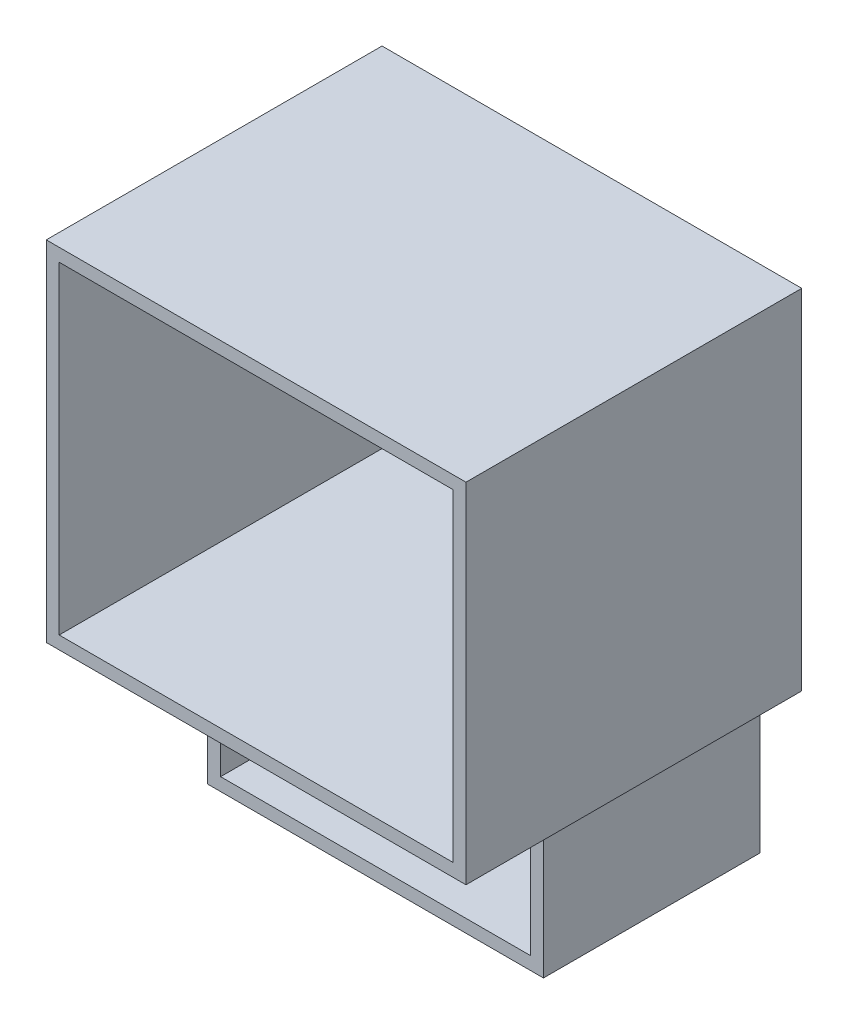
ISO-10303-21;
HEADER;
FILE_DESCRIPTION(('STEP AP214'),'2;1');
FILE_NAME('part.step','',(''),(''),'','','');
FILE_SCHEMA(('AUTOMOTIVE_DESIGN { 1 0 10303 214 1 1 1 1 }'));
ENDSEC;
DATA;
#1=APPLICATION_CONTEXT('core data for automotive mechanical design processes');
#2=APPLICATION_PROTOCOL_DEFINITION('international standard','automotive_design',2000,#1);
#3=PRODUCT_CONTEXT('',#1,'mechanical');
#4=PRODUCT('Part','Part','',(#3));
#5=PRODUCT_RELATED_PRODUCT_CATEGORY('part','',(#4));
#6=PRODUCT_DEFINITION_FORMATION('','',#4);
#7=PRODUCT_DEFINITION_CONTEXT('part definition',#1,'design');
#8=PRODUCT_DEFINITION('design','',#6,#7);
#9=PRODUCT_DEFINITION_SHAPE('','',#8);
#10=(LENGTH_UNIT() NAMED_UNIT(*) SI_UNIT(.MILLI.,.METRE.));
#11=(NAMED_UNIT(*) PLANE_ANGLE_UNIT() SI_UNIT($,.RADIAN.));
#12=(NAMED_UNIT(*) SI_UNIT($,.STERADIAN.) SOLID_ANGLE_UNIT());
#13=UNCERTAINTY_MEASURE_WITH_UNIT(LENGTH_MEASURE(1.E-05),#10,'distance_accuracy_value','');
#14=(GEOMETRIC_REPRESENTATION_CONTEXT(3) GLOBAL_UNCERTAINTY_ASSIGNED_CONTEXT((#13)) GLOBAL_UNIT_ASSIGNED_CONTEXT((#10,
#11,#12)) REPRESENTATION_CONTEXT('',''));
#15=CARTESIAN_POINT('',(0.,0.,0.));
#16=DIRECTION('',(0.,0.,1.));
#17=DIRECTION('',(1.,0.,0.));
#18=AXIS2_PLACEMENT_3D('',#15,#16,#17);
#19=CARTESIAN_POINT('',(-18.8,-30.,3.5));
#20=DIRECTION('',(0.,0.,-1.));
#21=DIRECTION('',(-1.,0.,0.));
#22=AXIS2_PLACEMENT_3D('',#19,#20,#21);
#23=CYLINDRICAL_SURFACE('',#22,1.8);
#24=CARTESIAN_POINT('',(-18.8,-30.,3.5));
#25=DIRECTION('',(0.,0.,1.));
#26=DIRECTION('',(1.,0.,0.));
#27=AXIS2_PLACEMENT_3D('',#24,#25,#26);
#28=CIRCLE('',#27,1.8);
#29=CARTESIAN_POINT('',(-17.,-30.,3.5));
#30=VERTEX_POINT('',#29);
#31=EDGE_CURVE('E232',#30,#30,#28,.T.);
#32=ORIENTED_EDGE('',*,*,#31,.T.);
#33=EDGE_LOOP('',(#32));
#34=FACE_BOUND('',#33,.T.);
#35=CARTESIAN_POINT('',(-18.8,-30.,2.5));
#36=DIRECTION('',(0.,0.,-1.));
#37=DIRECTION('',(-1.,0.,0.));
#38=AXIS2_PLACEMENT_3D('',#35,#36,#37);
#39=CIRCLE('',#38,1.8);
#40=CARTESIAN_POINT('',(-20.6,-30.,2.5));
#41=VERTEX_POINT('',#40);
#42=EDGE_CURVE('E67',#41,#41,#39,.T.);
#43=ORIENTED_EDGE('',*,*,#42,.T.);
#44=EDGE_LOOP('',(#43));
#45=FACE_BOUND('',#44,.T.);
#46=ADVANCED_FACE('F63',(#34,#45),#23,.F.);
#47=CARTESIAN_POINT('',(18.8,-30.,3.5));
#48=DIRECTION('',(0.,0.,-1.));
#49=DIRECTION('',(-1.,0.,0.));
#50=AXIS2_PLACEMENT_3D('',#47,#48,#49);
#51=CYLINDRICAL_SURFACE('',#50,1.8);
#52=CARTESIAN_POINT('',(18.8,-30.,3.5));
#53=DIRECTION('',(0.,0.,1.));
#54=DIRECTION('',(-1.,0.,0.));
#55=AXIS2_PLACEMENT_3D('',#52,#53,#54);
#56=CIRCLE('',#55,1.8);
#57=CARTESIAN_POINT('',(17.,-30.,3.5));
#58=VERTEX_POINT('',#57);
#59=EDGE_CURVE('E210',#58,#58,#56,.T.);
#60=ORIENTED_EDGE('',*,*,#59,.T.);
#61=EDGE_LOOP('',(#60));
#62=FACE_BOUND('',#61,.T.);
#63=CARTESIAN_POINT('',(18.8,-30.,2.5));
#64=DIRECTION('',(0.,0.,-1.));
#65=DIRECTION('',(-1.,0.,0.));
#66=AXIS2_PLACEMENT_3D('',#63,#64,#65);
#67=CIRCLE('',#66,1.8);
#68=CARTESIAN_POINT('',(17.,-30.,2.5));
#69=VERTEX_POINT('',#68);
#70=EDGE_CURVE('E331',#69,#69,#67,.T.);
#71=ORIENTED_EDGE('',*,*,#70,.T.);
#72=EDGE_LOOP('',(#71));
#73=FACE_BOUND('',#72,.T.);
#74=ADVANCED_FACE('F378',(#62,#73),#51,.F.);
#75=CARTESIAN_POINT('',(-32.5,-27.,2.));
#76=DIRECTION('',(0.,1.,0.));
#77=DIRECTION('',(0.,0.,1.));
#78=AXIS2_PLACEMENT_3D('',#75,#76,#77);
#79=PLANE('',#78);
#80=DIRECTION('',(0.,0.,-1.));
#81=VECTOR('',#80,1.);
#82=CARTESIAN_POINT('',(-26.,-27.,3.5));
#83=LINE('',#82,#81);
#84=CARTESIAN_POINT('',(-26.,-27.,33.5));
#85=VERTEX_POINT('',#84);
#86=CARTESIAN_POINT('',(-26.,-27.,0.));
#87=VERTEX_POINT('',#86);
#88=EDGE_CURVE('E80',#85,#87,#83,.T.);
#89=ORIENTED_EDGE('',*,*,#88,.F.);
#90=DIRECTION('',(1.,0.,0.));
#91=VECTOR('',#90,1.);
#92=CARTESIAN_POINT('',(-26.,-27.,33.5));
#93=LINE('',#92,#91);
#94=CARTESIAN_POINT('',(-24.,-27.,33.5));
#95=VERTEX_POINT('',#94);
#96=EDGE_CURVE('E85',#85,#95,#93,.T.);
#97=ORIENTED_EDGE('',*,*,#96,.T.);
#98=DIRECTION('',(0.,0.,-1.));
#99=VECTOR('',#98,1.);
#100=CARTESIAN_POINT('',(-24.,-27.,33.5));
#101=LINE('',#100,#99);
#102=CARTESIAN_POINT('',(-24.,-27.,3.5));
#103=VERTEX_POINT('',#102);
#104=EDGE_CURVE('E212',#95,#103,#101,.T.);
#105=ORIENTED_EDGE('',*,*,#104,.T.);
#106=DIRECTION('',(-1.,0.,0.));
#107=VECTOR('',#106,1.);
#108=CARTESIAN_POINT('',(-26.,-27.,3.5));
#109=LINE('',#108,#107);
#110=CARTESIAN_POINT('',(24.,-27.,3.5));
#111=VERTEX_POINT('',#110);
#112=EDGE_CURVE('E236',#111,#103,#109,.T.);
#113=ORIENTED_EDGE('',*,*,#112,.F.);
#114=DIRECTION('',(0.,0.,-1.));
#115=VECTOR('',#114,1.);
#116=CARTESIAN_POINT('',(24.,-27.,33.5));
#117=LINE('',#116,#115);
#118=CARTESIAN_POINT('',(24.,-27.,33.5));
#119=VERTEX_POINT('',#118);
#120=EDGE_CURVE('E207',#119,#111,#117,.T.);
#121=ORIENTED_EDGE('',*,*,#120,.F.);
#122=CARTESIAN_POINT('',(26.,-27.,33.5));
#123=VERTEX_POINT('',#122);
#124=EDGE_CURVE('E229',#119,#123,#93,.T.);
#125=ORIENTED_EDGE('',*,*,#124,.T.);
#126=DIRECTION('',(0.,0.,-1.));
#127=VECTOR('',#126,1.);
#128=CARTESIAN_POINT('',(26.,-27.,3.5));
#129=LINE('',#128,#127);
#130=CARTESIAN_POINT('',(26.,-27.,0.));
#131=VERTEX_POINT('',#130);
#132=EDGE_CURVE('E245',#123,#131,#129,.T.);
#133=ORIENTED_EDGE('',*,*,#132,.T.);
#134=DIRECTION('',(1.,0.,0.));
#135=VECTOR('',#134,1.);
#136=CARTESIAN_POINT('',(-32.5,-27.,0.));
#137=LINE('',#136,#135);
#138=CARTESIAN_POINT('',(32.5,-27.,0.));
#139=VERTEX_POINT('',#138);
#140=EDGE_CURVE('E321',#131,#139,#137,.T.);
#141=ORIENTED_EDGE('',*,*,#140,.T.);
#142=DIRECTION('',(0.,0.,-1.));
#143=VECTOR('',#142,1.);
#144=CARTESIAN_POINT('',(32.5,-27.,2.));
#145=LINE('',#144,#143);
#146=CARTESIAN_POINT('',(32.5,-27.,52.));
#147=VERTEX_POINT('',#146);
#148=EDGE_CURVE('E324',#147,#139,#145,.T.);
#149=ORIENTED_EDGE('',*,*,#148,.F.);
#150=DIRECTION('',(1.,0.,0.));
#151=VECTOR('',#150,1.);
#152=CARTESIAN_POINT('',(-32.5,-27.,52.));
#153=LINE('',#152,#151);
#154=CARTESIAN_POINT('',(-32.5,-27.,52.));
#155=VERTEX_POINT('',#154);
#156=EDGE_CURVE('E287',#155,#147,#153,.T.);
#157=ORIENTED_EDGE('',*,*,#156,.F.);
#158=DIRECTION('',(0.,0.,-1.));
#159=VECTOR('',#158,1.);
#160=CARTESIAN_POINT('',(-32.5,-27.,2.));
#161=LINE('',#160,#159);
#162=CARTESIAN_POINT('',(-32.5,-27.,0.));
#163=VERTEX_POINT('',#162);
#164=EDGE_CURVE('E327',#155,#163,#161,.T.);
#165=ORIENTED_EDGE('',*,*,#164,.T.);
#166=EDGE_CURVE('E322',#163,#87,#137,.T.);
#167=ORIENTED_EDGE('',*,*,#166,.T.);
#168=EDGE_LOOP('',(#89,#97,#105,#113,#121,#125,#133,#141,#149,#157,#165,#167));
#169=FACE_BOUND('',#168,.T.);
#170=ADVANCED_FACE('F367',(#169),#79,.F.);
#171=CARTESIAN_POINT('',(0.,0.,2.));
#172=DIRECTION('',(0.,0.,-1.));
#173=DIRECTION('',(-1.,0.,0.));
#174=AXIS2_PLACEMENT_3D('',#171,#172,#173);
#175=PLANE('',#174);
#176=DIRECTION('',(1.,0.,0.));
#177=VECTOR('',#176,1.);
#178=CARTESIAN_POINT('',(-30.5,-25.,2.));
#179=LINE('',#178,#177);
#180=CARTESIAN_POINT('',(-30.5,-25.,2.));
#181=VERTEX_POINT('',#180);
#182=CARTESIAN_POINT('',(30.5,-25.,2.));
#183=VERTEX_POINT('',#182);
#184=EDGE_CURVE('E252',#181,#183,#179,.T.);
#185=ORIENTED_EDGE('',*,*,#184,.T.);
#186=DIRECTION('',(0.,1.,0.));
#187=VECTOR('',#186,1.);
#188=CARTESIAN_POINT('',(30.5,-25.,2.));
#189=LINE('',#188,#187);
#190=CARTESIAN_POINT('',(30.5,25.,2.));
#191=VERTEX_POINT('',#190);
#192=EDGE_CURVE('E248',#183,#191,#189,.T.);
#193=ORIENTED_EDGE('',*,*,#192,.T.);
#194=DIRECTION('',(-1.,0.,0.));
#195=VECTOR('',#194,1.);
#196=CARTESIAN_POINT('',(-30.5,25.,2.));
#197=LINE('',#196,#195);
#198=CARTESIAN_POINT('',(-30.5,25.,2.));
#199=VERTEX_POINT('',#198);
#200=EDGE_CURVE('E262',#191,#199,#197,.T.);
#201=ORIENTED_EDGE('',*,*,#200,.T.);
#202=DIRECTION('',(0.,-1.,0.));
#203=VECTOR('',#202,1.);
#204=CARTESIAN_POINT('',(-30.5,-25.,2.));
#205=LINE('',#204,#203);
#206=EDGE_CURVE('E265',#199,#181,#205,.T.);
#207=ORIENTED_EDGE('',*,*,#206,.T.);
#208=EDGE_LOOP('',(#185,#193,#201,#207));
#209=FACE_BOUND('',#208,.T.);
#210=CARTESIAN_POINT('',(-26.,18.5,2.));
#211=DIRECTION('',(0.,0.,1.));
#212=DIRECTION('',(1.,0.,0.));
#213=AXIS2_PLACEMENT_3D('',#210,#211,#212);
#214=CIRCLE('',#213,1.5);
#215=CARTESIAN_POINT('',(-24.5,18.5,2.));
#216=VERTEX_POINT('',#215);
#217=EDGE_CURVE('E309',#216,#216,#214,.T.);
#218=ORIENTED_EDGE('',*,*,#217,.F.);
#219=EDGE_LOOP('',(#218));
#220=FACE_BOUND('',#219,.T.);
#221=CARTESIAN_POINT('',(26.,18.5,2.));
#222=DIRECTION('',(0.,0.,1.));
#223=DIRECTION('',(-1.,0.,0.));
#224=AXIS2_PLACEMENT_3D('',#221,#222,#223);
#225=CIRCLE('',#224,1.5);
#226=CARTESIAN_POINT('',(24.5,18.5,2.));
#227=VERTEX_POINT('',#226);
#228=EDGE_CURVE('E303',#227,#227,#225,.T.);
#229=ORIENTED_EDGE('',*,*,#228,.F.);
#230=EDGE_LOOP('',(#229));
#231=FACE_BOUND('',#230,.T.);
#232=CARTESIAN_POINT('',(-26.,-18.5,2.));
#233=DIRECTION('',(0.,0.,1.));
#234=DIRECTION('',(-1.,0.,0.));
#235=AXIS2_PLACEMENT_3D('',#232,#233,#234);
#236=CIRCLE('',#235,1.5);
#237=CARTESIAN_POINT('',(-27.5,-18.5,2.));
#238=VERTEX_POINT('',#237);
#239=EDGE_CURVE('E297',#238,#238,#236,.T.);
#240=ORIENTED_EDGE('',*,*,#239,.F.);
#241=EDGE_LOOP('',(#240));
#242=FACE_BOUND('',#241,.T.);
#243=CARTESIAN_POINT('',(26.,-18.5,2.));
#244=DIRECTION('',(0.,0.,1.));
#245=DIRECTION('',(1.,0.,0.));
#246=AXIS2_PLACEMENT_3D('',#243,#244,#245);
#247=CIRCLE('',#246,1.5);
#248=CARTESIAN_POINT('',(27.5,-18.5,2.));
#249=VERTEX_POINT('',#248);
#250=EDGE_CURVE('E291',#249,#249,#247,.T.);
#251=ORIENTED_EDGE('',*,*,#250,.F.);
#252=EDGE_LOOP('',(#251));
#253=FACE_BOUND('',#252,.T.);
#254=ADVANCED_FACE('F385',(#209,#220,#231,#242,#253),#175,.F.);
#255=CARTESIAN_POINT('',(0.,0.,0.));
#256=DIRECTION('',(0.,0.,-1.));
#257=DIRECTION('',(-1.,0.,0.));
#258=AXIS2_PLACEMENT_3D('',#255,#256,#257);
#259=PLANE('',#258);
#260=CARTESIAN_POINT('',(18.8,-30.,0.));
#261=DIRECTION('',(0.,0.,-1.));
#262=DIRECTION('',(-1.,0.,0.));
#263=AXIS2_PLACEMENT_3D('',#260,#261,#262);
#264=CIRCLE('',#263,3.1);
#265=CARTESIAN_POINT('',(15.7,-30.,0.));
#266=VERTEX_POINT('',#265);
#267=EDGE_CURVE('E338',#266,#266,#264,.T.);
#268=ORIENTED_EDGE('',*,*,#267,.F.);
#269=EDGE_LOOP('',(#268));
#270=FACE_BOUND('',#269,.T.);
#271=CARTESIAN_POINT('',(-18.8,-30.,0.));
#272=DIRECTION('',(0.,0.,-1.));
#273=DIRECTION('',(-1.,0.,0.));
#274=AXIS2_PLACEMENT_3D('',#271,#272,#273);
#275=CIRCLE('',#274,3.1);
#276=CARTESIAN_POINT('',(-21.9,-30.,0.));
#277=VERTEX_POINT('',#276);
#278=EDGE_CURVE('E343',#277,#277,#275,.T.);
#279=ORIENTED_EDGE('',*,*,#278,.F.);
#280=EDGE_LOOP('',(#279));
#281=FACE_BOUND('',#280,.T.);
#282=CARTESIAN_POINT('',(-26.,-18.5,0.));
#283=DIRECTION('',(0.,0.,1.));
#284=DIRECTION('',(-1.,0.,0.));
#285=AXIS2_PLACEMENT_3D('',#282,#283,#284);
#286=CIRCLE('',#285,1.5);
#287=CARTESIAN_POINT('',(-27.5,-18.5,0.));
#288=VERTEX_POINT('',#287);
#289=EDGE_CURVE('E294',#288,#288,#286,.T.);
#290=ORIENTED_EDGE('',*,*,#289,.T.);
#291=EDGE_LOOP('',(#290));
#292=FACE_BOUND('',#291,.T.);
#293=CARTESIAN_POINT('',(-26.,18.5,0.));
#294=DIRECTION('',(0.,0.,1.));
#295=DIRECTION('',(1.,0.,0.));
#296=AXIS2_PLACEMENT_3D('',#293,#294,#295);
#297=CIRCLE('',#296,1.5);
#298=CARTESIAN_POINT('',(-24.5,18.5,0.));
#299=VERTEX_POINT('',#298);
#300=EDGE_CURVE('E306',#299,#299,#297,.T.);
#301=ORIENTED_EDGE('',*,*,#300,.T.);
#302=EDGE_LOOP('',(#301));
#303=FACE_BOUND('',#302,.T.);
#304=DIRECTION('',(0.,1.,0.));
#305=VECTOR('',#304,1.);
#306=CARTESIAN_POINT('',(32.5,-27.,0.));
#307=LINE('',#306,#305);
#308=CARTESIAN_POINT('',(32.5,27.,0.));
#309=VERTEX_POINT('',#308);
#310=EDGE_CURVE('E312',#139,#309,#307,.T.);
#311=ORIENTED_EDGE('',*,*,#310,.F.);
#312=ORIENTED_EDGE('',*,*,#140,.F.);
#313=DIRECTION('',(0.,1.,0.));
#314=VECTOR('',#313,1.);
#315=CARTESIAN_POINT('',(26.,-52.,0.));
#316=LINE('',#315,#314);
#317=CARTESIAN_POINT('',(26.,-52.,0.));
#318=VERTEX_POINT('',#317);
#319=EDGE_CURVE('E235',#318,#131,#316,.T.);
#320=ORIENTED_EDGE('',*,*,#319,.F.);
#321=DIRECTION('',(1.,0.,0.));
#322=VECTOR('',#321,1.);
#323=CARTESIAN_POINT('',(-26.,-52.,0.));
#324=LINE('',#323,#322);
#325=CARTESIAN_POINT('',(-26.,-52.,0.));
#326=VERTEX_POINT('',#325);
#327=EDGE_CURVE('E239',#326,#318,#324,.T.);
#328=ORIENTED_EDGE('',*,*,#327,.F.);
#329=DIRECTION('',(0.,-1.,0.));
#330=VECTOR('',#329,1.);
#331=CARTESIAN_POINT('',(-26.,-52.,0.));
#332=LINE('',#331,#330);
#333=EDGE_CURVE('E181',#87,#326,#332,.T.);
#334=ORIENTED_EDGE('',*,*,#333,.F.);
#335=ORIENTED_EDGE('',*,*,#166,.F.);
#336=DIRECTION('',(0.,-1.,0.));
#337=VECTOR('',#336,1.);
#338=CARTESIAN_POINT('',(-32.5,-27.,0.));
#339=LINE('',#338,#337);
#340=CARTESIAN_POINT('',(-32.5,27.,0.));
#341=VERTEX_POINT('',#340);
#342=EDGE_CURVE('E319',#341,#163,#339,.T.);
#343=ORIENTED_EDGE('',*,*,#342,.F.);
#344=DIRECTION('',(-1.,0.,0.));
#345=VECTOR('',#344,1.);
#346=CARTESIAN_POINT('',(-32.5,27.,0.));
#347=LINE('',#346,#345);
#348=EDGE_CURVE('E317',#309,#341,#347,.T.);
#349=ORIENTED_EDGE('',*,*,#348,.F.);
#350=EDGE_LOOP('',(#311,#312,#320,#328,#334,#335,#343,#349));
#351=FACE_BOUND('',#350,.T.);
#352=CARTESIAN_POINT('',(26.,18.5,0.));
#353=DIRECTION('',(0.,0.,1.));
#354=DIRECTION('',(-1.,0.,0.));
#355=AXIS2_PLACEMENT_3D('',#352,#353,#354);
#356=CIRCLE('',#355,1.5);
#357=CARTESIAN_POINT('',(24.5,18.5,0.));
#358=VERTEX_POINT('',#357);
#359=EDGE_CURVE('E300',#358,#358,#356,.T.);
#360=ORIENTED_EDGE('',*,*,#359,.T.);
#361=EDGE_LOOP('',(#360));
#362=FACE_BOUND('',#361,.T.);
#363=CARTESIAN_POINT('',(26.,-18.5,0.));
#364=DIRECTION('',(0.,0.,1.));
#365=DIRECTION('',(1.,0.,0.));
#366=AXIS2_PLACEMENT_3D('',#363,#364,#365);
#367=CIRCLE('',#366,1.5);
#368=CARTESIAN_POINT('',(27.5,-18.5,0.));
#369=VERTEX_POINT('',#368);
#370=EDGE_CURVE('E290',#369,#369,#367,.T.);
#371=ORIENTED_EDGE('',*,*,#370,.T.);
#372=EDGE_LOOP('',(#371));
#373=FACE_BOUND('',#372,.T.);
#374=ADVANCED_FACE('F436',(#270,#281,#292,#303,#351,#362,#373),#259,.T.);
#375=CARTESIAN_POINT('',(32.5,-27.,2.));
#376=DIRECTION('',(-1.,0.,0.));
#377=DIRECTION('',(0.,0.,1.));
#378=AXIS2_PLACEMENT_3D('',#375,#376,#377);
#379=PLANE('',#378);
#380=ORIENTED_EDGE('',*,*,#310,.T.);
#381=DIRECTION('',(0.,0.,-1.));
#382=VECTOR('',#381,1.);
#383=CARTESIAN_POINT('',(32.5,27.,2.));
#384=LINE('',#383,#382);
#385=CARTESIAN_POINT('',(32.5,27.,52.));
#386=VERTEX_POINT('',#385);
#387=EDGE_CURVE('E12',#386,#309,#384,.T.);
#388=ORIENTED_EDGE('',*,*,#387,.F.);
#389=DIRECTION('',(0.,1.,0.));
#390=VECTOR('',#389,1.);
#391=CARTESIAN_POINT('',(32.5,-27.,52.));
#392=LINE('',#391,#390);
#393=EDGE_CURVE('E278',#147,#386,#392,.T.);
#394=ORIENTED_EDGE('',*,*,#393,.F.);
#395=ORIENTED_EDGE('',*,*,#148,.T.);
#396=EDGE_LOOP('',(#380,#388,#394,#395));
#397=FACE_BOUND('',#396,.T.);
#398=ADVANCED_FACE('F65',(#397),#379,.F.);
#399=CARTESIAN_POINT('',(-32.5,27.,2.));
#400=DIRECTION('',(0.,-1.,0.));
#401=DIRECTION('',(0.,0.,-1.));
#402=AXIS2_PLACEMENT_3D('',#399,#400,#401);
#403=PLANE('',#402);
#404=ORIENTED_EDGE('',*,*,#348,.T.);
#405=DIRECTION('',(0.,0.,-1.));
#406=VECTOR('',#405,1.);
#407=CARTESIAN_POINT('',(-32.5,27.,2.));
#408=LINE('',#407,#406);
#409=CARTESIAN_POINT('',(-32.5,27.,52.));
#410=VERTEX_POINT('',#409);
#411=EDGE_CURVE('E72',#410,#341,#408,.T.);
#412=ORIENTED_EDGE('',*,*,#411,.F.);
#413=DIRECTION('',(-1.,0.,0.));
#414=VECTOR('',#413,1.);
#415=CARTESIAN_POINT('',(-32.5,27.,52.));
#416=LINE('',#415,#414);
#417=EDGE_CURVE('E281',#386,#410,#416,.T.);
#418=ORIENTED_EDGE('',*,*,#417,.F.);
#419=ORIENTED_EDGE('',*,*,#387,.T.);
#420=EDGE_LOOP('',(#404,#412,#418,#419));
#421=FACE_BOUND('',#420,.T.);
#422=ADVANCED_FACE('F442',(#421),#403,.F.);
#423=CARTESIAN_POINT('',(-32.5,-27.,2.));
#424=DIRECTION('',(1.,0.,0.));
#425=DIRECTION('',(0.,0.,-1.));
#426=AXIS2_PLACEMENT_3D('',#423,#424,#425);
#427=PLANE('',#426);
#428=ORIENTED_EDGE('',*,*,#342,.T.);
#429=ORIENTED_EDGE('',*,*,#164,.F.);
#430=DIRECTION('',(0.,-1.,0.));
#431=VECTOR('',#430,1.);
#432=CARTESIAN_POINT('',(-32.5,-27.,52.));
#433=LINE('',#432,#431);
#434=EDGE_CURVE('E284',#410,#155,#433,.T.);
#435=ORIENTED_EDGE('',*,*,#434,.F.);
#436=ORIENTED_EDGE('',*,*,#411,.T.);
#437=EDGE_LOOP('',(#428,#429,#435,#436));
#438=FACE_BOUND('',#437,.T.);
#439=ADVANCED_FACE('F432',(#438),#427,.F.);
#440=CARTESIAN_POINT('',(-26.,18.5,2.));
#441=DIRECTION('',(0.,0.,-1.));
#442=DIRECTION('',(-1.,0.,0.));
#443=AXIS2_PLACEMENT_3D('',#440,#441,#442);
#444=CYLINDRICAL_SURFACE('',#443,1.5);
#445=ORIENTED_EDGE('',*,*,#217,.T.);
#446=EDGE_LOOP('',(#445));
#447=FACE_BOUND('',#446,.T.);
#448=ORIENTED_EDGE('',*,*,#300,.F.);
#449=EDGE_LOOP('',(#448));
#450=FACE_BOUND('',#449,.T.);
#451=ADVANCED_FACE('F428',(#447,#450),#444,.F.);
#452=CARTESIAN_POINT('',(26.,18.5,2.));
#453=DIRECTION('',(0.,0.,-1.));
#454=DIRECTION('',(-1.,0.,0.));
#455=AXIS2_PLACEMENT_3D('',#452,#453,#454);
#456=CYLINDRICAL_SURFACE('',#455,1.5);
#457=ORIENTED_EDGE('',*,*,#228,.T.);
#458=EDGE_LOOP('',(#457));
#459=FACE_BOUND('',#458,.T.);
#460=ORIENTED_EDGE('',*,*,#359,.F.);
#461=EDGE_LOOP('',(#460));
#462=FACE_BOUND('',#461,.T.);
#463=ADVANCED_FACE('F424',(#459,#462),#456,.F.);
#464=CARTESIAN_POINT('',(-26.,-18.5,2.));
#465=DIRECTION('',(0.,0.,-1.));
#466=DIRECTION('',(-1.,0.,0.));
#467=AXIS2_PLACEMENT_3D('',#464,#465,#466);
#468=CYLINDRICAL_SURFACE('',#467,1.5);
#469=ORIENTED_EDGE('',*,*,#239,.T.);
#470=EDGE_LOOP('',(#469));
#471=FACE_BOUND('',#470,.T.);
#472=ORIENTED_EDGE('',*,*,#289,.F.);
#473=EDGE_LOOP('',(#472));
#474=FACE_BOUND('',#473,.T.);
#475=ADVANCED_FACE('F420',(#471,#474),#468,.F.);
#476=CARTESIAN_POINT('',(26.,-18.5,2.));
#477=DIRECTION('',(0.,0.,-1.));
#478=DIRECTION('',(-1.,0.,0.));
#479=AXIS2_PLACEMENT_3D('',#476,#477,#478);
#480=CYLINDRICAL_SURFACE('',#479,1.5);
#481=ORIENTED_EDGE('',*,*,#250,.T.);
#482=EDGE_LOOP('',(#481));
#483=FACE_BOUND('',#482,.T.);
#484=ORIENTED_EDGE('',*,*,#370,.F.);
#485=EDGE_LOOP('',(#484));
#486=FACE_BOUND('',#485,.T.);
#487=ADVANCED_FACE('F416',(#483,#486),#480,.F.);
#488=CARTESIAN_POINT('',(0.,0.,52.));
#489=DIRECTION('',(0.,0.,-1.));
#490=DIRECTION('',(-1.,0.,0.));
#491=AXIS2_PLACEMENT_3D('',#488,#489,#490);
#492=PLANE('',#491);
#493=ORIENTED_EDGE('',*,*,#393,.T.);
#494=ORIENTED_EDGE('',*,*,#417,.T.);
#495=ORIENTED_EDGE('',*,*,#434,.T.);
#496=ORIENTED_EDGE('',*,*,#156,.T.);
#497=EDGE_LOOP('',(#493,#494,#495,#496));
#498=FACE_BOUND('',#497,.T.);
#499=DIRECTION('',(0.,1.,0.));
#500=VECTOR('',#499,1.);
#501=CARTESIAN_POINT('',(30.5,-25.,52.));
#502=LINE('',#501,#500);
#503=CARTESIAN_POINT('',(30.5,-25.,52.));
#504=VERTEX_POINT('',#503);
#505=CARTESIAN_POINT('',(30.5,25.,52.));
#506=VERTEX_POINT('',#505);
#507=EDGE_CURVE('E249',#504,#506,#502,.T.);
#508=ORIENTED_EDGE('',*,*,#507,.F.);
#509=DIRECTION('',(1.,0.,0.));
#510=VECTOR('',#509,1.);
#511=CARTESIAN_POINT('',(-30.5,-25.,52.));
#512=LINE('',#511,#510);
#513=CARTESIAN_POINT('',(-30.5,-25.,52.));
#514=VERTEX_POINT('',#513);
#515=EDGE_CURVE('E257',#514,#504,#512,.T.);
#516=ORIENTED_EDGE('',*,*,#515,.F.);
#517=DIRECTION('',(0.,-1.,0.));
#518=VECTOR('',#517,1.);
#519=CARTESIAN_POINT('',(-30.5,-25.,52.));
#520=LINE('',#519,#518);
#521=CARTESIAN_POINT('',(-30.5,25.,52.));
#522=VERTEX_POINT('',#521);
#523=EDGE_CURVE('E254',#522,#514,#520,.T.);
#524=ORIENTED_EDGE('',*,*,#523,.F.);
#525=DIRECTION('',(-1.,0.,0.));
#526=VECTOR('',#525,1.);
#527=CARTESIAN_POINT('',(-30.5,25.,52.));
#528=LINE('',#527,#526);
#529=EDGE_CURVE('E251',#506,#522,#528,.T.);
#530=ORIENTED_EDGE('',*,*,#529,.F.);
#531=EDGE_LOOP('',(#508,#516,#524,#530));
#532=FACE_BOUND('',#531,.T.);
#533=ADVANCED_FACE('F412',(#498,#532),#492,.F.);
#534=CARTESIAN_POINT('',(30.5,-25.,52.));
#535=DIRECTION('',(-1.,0.,0.));
#536=DIRECTION('',(0.,0.,1.));
#537=AXIS2_PLACEMENT_3D('',#534,#535,#536);
#538=PLANE('',#537);
#539=ORIENTED_EDGE('',*,*,#192,.F.);
#540=DIRECTION('',(0.,0.,-1.));
#541=VECTOR('',#540,1.);
#542=CARTESIAN_POINT('',(30.5,-25.,52.));
#543=LINE('',#542,#541);
#544=EDGE_CURVE('E259',#504,#183,#543,.T.);
#545=ORIENTED_EDGE('',*,*,#544,.F.);
#546=ORIENTED_EDGE('',*,*,#507,.T.);
#547=DIRECTION('',(0.,0.,-1.));
#548=VECTOR('',#547,1.);
#549=CARTESIAN_POINT('',(30.5,25.,52.));
#550=LINE('',#549,#548);
#551=EDGE_CURVE('E275',#506,#191,#550,.T.);
#552=ORIENTED_EDGE('',*,*,#551,.T.);
#553=EDGE_LOOP('',(#539,#545,#546,#552));
#554=FACE_BOUND('',#553,.T.);
#555=ADVANCED_FACE('F408',(#554),#538,.T.);
#556=CARTESIAN_POINT('',(-30.5,25.,52.));
#557=DIRECTION('',(0.,-1.,0.));
#558=DIRECTION('',(0.,0.,-1.));
#559=AXIS2_PLACEMENT_3D('',#556,#557,#558);
#560=PLANE('',#559);
#561=ORIENTED_EDGE('',*,*,#200,.F.);
#562=ORIENTED_EDGE('',*,*,#551,.F.);
#563=ORIENTED_EDGE('',*,*,#529,.T.);
#564=DIRECTION('',(0.,0.,-1.));
#565=VECTOR('',#564,1.);
#566=CARTESIAN_POINT('',(-30.5,25.,52.));
#567=LINE('',#566,#565);
#568=EDGE_CURVE('E273',#522,#199,#567,.T.);
#569=ORIENTED_EDGE('',*,*,#568,.T.);
#570=EDGE_LOOP('',(#561,#562,#563,#569));
#571=FACE_BOUND('',#570,.T.);
#572=ADVANCED_FACE('F404',(#571),#560,.T.);
#573=CARTESIAN_POINT('',(-30.5,-25.,52.));
#574=DIRECTION('',(1.,0.,0.));
#575=DIRECTION('',(0.,0.,-1.));
#576=AXIS2_PLACEMENT_3D('',#573,#574,#575);
#577=PLANE('',#576);
#578=ORIENTED_EDGE('',*,*,#206,.F.);
#579=ORIENTED_EDGE('',*,*,#568,.F.);
#580=ORIENTED_EDGE('',*,*,#523,.T.);
#581=DIRECTION('',(0.,0.,-1.));
#582=VECTOR('',#581,1.);
#583=CARTESIAN_POINT('',(-30.5,-25.,52.));
#584=LINE('',#583,#582);
#585=EDGE_CURVE('E271',#514,#181,#584,.T.);
#586=ORIENTED_EDGE('',*,*,#585,.T.);
#587=EDGE_LOOP('',(#578,#579,#580,#586));
#588=FACE_BOUND('',#587,.T.);
#589=ADVANCED_FACE('F400',(#588),#577,.T.);
#590=CARTESIAN_POINT('',(-30.5,-25.,52.));
#591=DIRECTION('',(0.,1.,0.));
#592=DIRECTION('',(0.,0.,1.));
#593=AXIS2_PLACEMENT_3D('',#590,#591,#592);
#594=PLANE('',#593);
#595=ORIENTED_EDGE('',*,*,#184,.F.);
#596=ORIENTED_EDGE('',*,*,#585,.F.);
#597=ORIENTED_EDGE('',*,*,#515,.T.);
#598=ORIENTED_EDGE('',*,*,#544,.T.);
#599=EDGE_LOOP('',(#595,#596,#597,#598));
#600=FACE_BOUND('',#599,.T.);
#601=ADVANCED_FACE('F372',(#600),#594,.T.);
#602=CARTESIAN_POINT('',(0.,0.,3.5));
#603=DIRECTION('',(0.,0.,-1.));
#604=DIRECTION('',(-1.,0.,0.));
#605=AXIS2_PLACEMENT_3D('',#602,#603,#604);
#606=PLANE('',#605);
#607=ORIENTED_EDGE('',*,*,#112,.T.);
#608=DIRECTION('',(0.,-1.,0.));
#609=VECTOR('',#608,1.);
#610=CARTESIAN_POINT('',(-24.,0.,3.5));
#611=LINE('',#610,#609);
#612=CARTESIAN_POINT('',(-24.,-50.,3.5));
#613=VERTEX_POINT('',#612);
#614=EDGE_CURVE('E199',#103,#613,#611,.T.);
#615=ORIENTED_EDGE('',*,*,#614,.T.);
#616=DIRECTION('',(1.,0.,0.));
#617=VECTOR('',#616,1.);
#618=CARTESIAN_POINT('',(0.,-50.,3.5));
#619=LINE('',#618,#617);
#620=CARTESIAN_POINT('',(24.,-50.,3.5));
#621=VERTEX_POINT('',#620);
#622=EDGE_CURVE('E201',#613,#621,#619,.T.);
#623=ORIENTED_EDGE('',*,*,#622,.T.);
#624=DIRECTION('',(0.,-1.,0.));
#625=VECTOR('',#624,1.);
#626=CARTESIAN_POINT('',(24.,0.,3.5));
#627=LINE('',#626,#625);
#628=EDGE_CURVE('E211',#111,#621,#627,.T.);
#629=ORIENTED_EDGE('',*,*,#628,.F.);
#630=EDGE_LOOP('',(#607,#615,#623,#629));
#631=FACE_BOUND('',#630,.T.);
#632=ORIENTED_EDGE('',*,*,#31,.F.);
#633=EDGE_LOOP('',(#632));
#634=FACE_BOUND('',#633,.T.);
#635=ORIENTED_EDGE('',*,*,#59,.F.);
#636=EDGE_LOOP('',(#635));
#637=FACE_BOUND('',#636,.T.);
#638=ADVANCED_FACE('F369',(#631,#634,#637),#606,.F.);
#639=CARTESIAN_POINT('',(26.,-52.,3.5));
#640=DIRECTION('',(-1.,0.,0.));
#641=DIRECTION('',(0.,0.,1.));
#642=AXIS2_PLACEMENT_3D('',#639,#640,#641);
#643=PLANE('',#642);
#644=ORIENTED_EDGE('',*,*,#319,.T.);
#645=ORIENTED_EDGE('',*,*,#132,.F.);
#646=DIRECTION('',(0.,-1.,0.));
#647=VECTOR('',#646,1.);
#648=CARTESIAN_POINT('',(26.,-27.,33.5));
#649=LINE('',#648,#647);
#650=CARTESIAN_POINT('',(26.,-52.,33.5));
#651=VERTEX_POINT('',#650);
#652=EDGE_CURVE('E205',#123,#651,#649,.T.);
#653=ORIENTED_EDGE('',*,*,#652,.T.);
#654=DIRECTION('',(0.,0.,-1.));
#655=VECTOR('',#654,1.);
#656=CARTESIAN_POINT('',(26.,-52.,3.5));
#657=LINE('',#656,#655);
#658=EDGE_CURVE('E185',#651,#318,#657,.T.);
#659=ORIENTED_EDGE('',*,*,#658,.T.);
#660=EDGE_LOOP('',(#644,#645,#653,#659));
#661=FACE_BOUND('',#660,.T.);
#662=ADVANCED_FACE('F352',(#661),#643,.F.);
#663=CARTESIAN_POINT('',(-26.,-52.,3.5));
#664=DIRECTION('',(1.,0.,0.));
#665=DIRECTION('',(0.,0.,-1.));
#666=AXIS2_PLACEMENT_3D('',#663,#664,#665);
#667=PLANE('',#666);
#668=ORIENTED_EDGE('',*,*,#333,.T.);
#669=DIRECTION('',(0.,0.,-1.));
#670=VECTOR('',#669,1.);
#671=CARTESIAN_POINT('',(-26.,-52.,3.5));
#672=LINE('',#671,#670);
#673=CARTESIAN_POINT('',(-26.,-52.,33.5));
#674=VERTEX_POINT('',#673);
#675=EDGE_CURVE('E176',#674,#326,#672,.T.);
#676=ORIENTED_EDGE('',*,*,#675,.F.);
#677=DIRECTION('',(0.,-1.,0.));
#678=VECTOR('',#677,1.);
#679=CARTESIAN_POINT('',(-26.,-27.,33.5));
#680=LINE('',#679,#678);
#681=EDGE_CURVE('E179',#85,#674,#680,.T.);
#682=ORIENTED_EDGE('',*,*,#681,.F.);
#683=ORIENTED_EDGE('',*,*,#88,.T.);
#684=EDGE_LOOP('',(#668,#676,#682,#683));
#685=FACE_BOUND('',#684,.T.);
#686=ADVANCED_FACE('F178',(#685),#667,.F.);
#687=CARTESIAN_POINT('',(-26.,-52.,3.5));
#688=DIRECTION('',(0.,1.,0.));
#689=DIRECTION('',(0.,0.,1.));
#690=AXIS2_PLACEMENT_3D('',#687,#688,#689);
#691=PLANE('',#690);
#692=ORIENTED_EDGE('',*,*,#327,.T.);
#693=ORIENTED_EDGE('',*,*,#658,.F.);
#694=DIRECTION('',(1.,0.,0.));
#695=VECTOR('',#694,1.);
#696=CARTESIAN_POINT('',(-26.,-52.,33.5));
#697=LINE('',#696,#695);
#698=EDGE_CURVE('E192',#674,#651,#697,.T.);
#699=ORIENTED_EDGE('',*,*,#698,.F.);
#700=ORIENTED_EDGE('',*,*,#675,.T.);
#701=EDGE_LOOP('',(#692,#693,#699,#700));
#702=FACE_BOUND('',#701,.T.);
#703=ADVANCED_FACE('F197',(#702),#691,.F.);
#704=CARTESIAN_POINT('',(0.,0.,33.5));
#705=DIRECTION('',(0.,0.,-1.));
#706=DIRECTION('',(-1.,0.,0.));
#707=AXIS2_PLACEMENT_3D('',#704,#705,#706);
#708=PLANE('',#707);
#709=ORIENTED_EDGE('',*,*,#124,.F.);
#710=DIRECTION('',(0.,-1.,0.));
#711=VECTOR('',#710,1.);
#712=CARTESIAN_POINT('',(24.,0.,33.5));
#713=LINE('',#712,#711);
#714=CARTESIAN_POINT('',(24.,-50.,33.5));
#715=VERTEX_POINT('',#714);
#716=EDGE_CURVE('E195',#119,#715,#713,.T.);
#717=ORIENTED_EDGE('',*,*,#716,.T.);
#718=DIRECTION('',(1.,0.,0.));
#719=VECTOR('',#718,1.);
#720=CARTESIAN_POINT('',(0.,-50.,33.5));
#721=LINE('',#720,#719);
#722=CARTESIAN_POINT('',(-24.,-50.,33.5));
#723=VERTEX_POINT('',#722);
#724=EDGE_CURVE('E221',#723,#715,#721,.T.);
#725=ORIENTED_EDGE('',*,*,#724,.F.);
#726=DIRECTION('',(0.,-1.,0.));
#727=VECTOR('',#726,1.);
#728=CARTESIAN_POINT('',(-24.,0.,33.5));
#729=LINE('',#728,#727);
#730=EDGE_CURVE('E217',#95,#723,#729,.T.);
#731=ORIENTED_EDGE('',*,*,#730,.F.);
#732=ORIENTED_EDGE('',*,*,#96,.F.);
#733=ORIENTED_EDGE('',*,*,#681,.T.);
#734=ORIENTED_EDGE('',*,*,#698,.T.);
#735=ORIENTED_EDGE('',*,*,#652,.F.);
#736=EDGE_LOOP('',(#709,#717,#725,#731,#732,#733,#734,#735));
#737=FACE_BOUND('',#736,.T.);
#738=ADVANCED_FACE('F190',(#737),#708,.F.);
#739=CARTESIAN_POINT('',(0.,-50.,33.5));
#740=DIRECTION('',(0.,1.,0.));
#741=DIRECTION('',(0.,0.,1.));
#742=AXIS2_PLACEMENT_3D('',#739,#740,#741);
#743=PLANE('',#742);
#744=ORIENTED_EDGE('',*,*,#622,.F.);
#745=DIRECTION('',(0.,0.,-1.));
#746=VECTOR('',#745,1.);
#747=CARTESIAN_POINT('',(-24.,-50.,33.5));
#748=LINE('',#747,#746);
#749=EDGE_CURVE('E214',#723,#613,#748,.T.);
#750=ORIENTED_EDGE('',*,*,#749,.F.);
#751=ORIENTED_EDGE('',*,*,#724,.T.);
#752=DIRECTION('',(0.,0.,-1.));
#753=VECTOR('',#752,1.);
#754=CARTESIAN_POINT('',(24.,-50.,33.5));
#755=LINE('',#754,#753);
#756=EDGE_CURVE('E218',#715,#621,#755,.T.);
#757=ORIENTED_EDGE('',*,*,#756,.T.);
#758=EDGE_LOOP('',(#744,#750,#751,#757));
#759=FACE_BOUND('',#758,.T.);
#760=ADVANCED_FACE('F361',(#759),#743,.T.);
#761=CARTESIAN_POINT('',(-24.,0.,33.5));
#762=DIRECTION('',(1.,0.,0.));
#763=DIRECTION('',(0.,1.,0.));
#764=AXIS2_PLACEMENT_3D('',#761,#762,#763);
#765=PLANE('',#764);
#766=ORIENTED_EDGE('',*,*,#614,.F.);
#767=ORIENTED_EDGE('',*,*,#104,.F.);
#768=ORIENTED_EDGE('',*,*,#730,.T.);
#769=ORIENTED_EDGE('',*,*,#749,.T.);
#770=EDGE_LOOP('',(#766,#767,#768,#769));
#771=FACE_BOUND('',#770,.T.);
#772=ADVANCED_FACE('F365',(#771),#765,.T.);
#773=CARTESIAN_POINT('',(24.,0.,33.5));
#774=DIRECTION('',(1.,0.,0.));
#775=DIRECTION('',(0.,1.,0.));
#776=AXIS2_PLACEMENT_3D('',#773,#774,#775);
#777=PLANE('',#776);
#778=ORIENTED_EDGE('',*,*,#628,.T.);
#779=ORIENTED_EDGE('',*,*,#756,.F.);
#780=ORIENTED_EDGE('',*,*,#716,.F.);
#781=ORIENTED_EDGE('',*,*,#120,.T.);
#782=EDGE_LOOP('',(#778,#779,#780,#781));
#783=FACE_BOUND('',#782,.T.);
#784=ADVANCED_FACE('F358',(#783),#777,.F.);
#785=CARTESIAN_POINT('',(18.8,-30.,2.5));
#786=DIRECTION('',(0.,0.,-1.));
#787=DIRECTION('',(-1.,0.,0.));
#788=AXIS2_PLACEMENT_3D('',#785,#786,#787);
#789=CYLINDRICAL_SURFACE('',#788,3.1);
#790=CARTESIAN_POINT('',(18.8,-30.,2.5));
#791=DIRECTION('',(0.,0.,-1.));
#792=DIRECTION('',(-1.,0.,0.));
#793=AXIS2_PLACEMENT_3D('',#790,#791,#792);
#794=CIRCLE('',#793,3.1);
#795=CARTESIAN_POINT('',(15.7,-30.,2.5));
#796=VERTEX_POINT('',#795);
#797=EDGE_CURVE('E333',#796,#796,#794,.T.);
#798=ORIENTED_EDGE('',*,*,#797,.F.);
#799=EDGE_LOOP('',(#798));
#800=FACE_BOUND('',#799,.T.);
#801=ORIENTED_EDGE('',*,*,#267,.T.);
#802=EDGE_LOOP('',(#801));
#803=FACE_BOUND('',#802,.T.);
#804=ADVANCED_FACE('F573',(#800,#803),#789,.F.);
#805=CARTESIAN_POINT('',(18.8,-30.,2.5));
#806=DIRECTION('',(0.,0.,-1.));
#807=DIRECTION('',(-1.,0.,0.));
#808=AXIS2_PLACEMENT_3D('',#805,#806,#807);
#809=PLANE('',#808);
#810=ORIENTED_EDGE('',*,*,#70,.F.);
#811=EDGE_LOOP('',(#810));
#812=FACE_BOUND('',#811,.T.);
#813=ORIENTED_EDGE('',*,*,#797,.T.);
#814=EDGE_LOOP('',(#813));
#815=FACE_BOUND('',#814,.T.);
#816=ADVANCED_FACE('F724',(#812,#815),#809,.T.);
#817=CARTESIAN_POINT('',(-18.8,-30.,2.5));
#818=DIRECTION('',(0.,0.,-1.));
#819=DIRECTION('',(-1.,0.,0.));
#820=AXIS2_PLACEMENT_3D('',#817,#818,#819);
#821=CYLINDRICAL_SURFACE('',#820,3.1);
#822=CARTESIAN_POINT('',(-18.8,-30.,2.5));
#823=DIRECTION('',(0.,0.,-1.));
#824=DIRECTION('',(-1.,0.,0.));
#825=AXIS2_PLACEMENT_3D('',#822,#823,#824);
#826=CIRCLE('',#825,3.1);
#827=CARTESIAN_POINT('',(-21.9,-30.,2.5));
#828=VERTEX_POINT('',#827);
#829=EDGE_CURVE('E348',#828,#828,#826,.T.);
#830=ORIENTED_EDGE('',*,*,#829,.F.);
#831=EDGE_LOOP('',(#830));
#832=FACE_BOUND('',#831,.T.);
#833=ORIENTED_EDGE('',*,*,#278,.T.);
#834=EDGE_LOOP('',(#833));
#835=FACE_BOUND('',#834,.T.);
#836=ADVANCED_FACE('F735',(#832,#835),#821,.F.);
#837=CARTESIAN_POINT('',(-18.8,-30.,2.5));
#838=DIRECTION('',(0.,0.,-1.));
#839=DIRECTION('',(-1.,0.,0.));
#840=AXIS2_PLACEMENT_3D('',#837,#838,#839);
#841=PLANE('',#840);
#842=ORIENTED_EDGE('',*,*,#42,.F.);
#843=EDGE_LOOP('',(#842));
#844=FACE_BOUND('',#843,.T.);
#845=ORIENTED_EDGE('',*,*,#829,.T.);
#846=EDGE_LOOP('',(#845));
#847=FACE_BOUND('',#846,.T.);
#848=ADVANCED_FACE('F746',(#844,#847),#841,.T.);
#849=CLOSED_SHELL('',(#46,#74,#170,#254,#374,#398,#422,#439,#451,#463,#475,#487,#533,#555,#572,
#589,#601,#638,#662,#686,#703,#738,#760,#772,#784,#804,#816,#836,#848));
#850=MANIFOLD_SOLID_BREP('B2',#849);
#851=ADVANCED_BREP_SHAPE_REPRESENTATION('',(#18,#850),#14);
#852=SHAPE_DEFINITION_REPRESENTATION(#9,#851);
ENDSEC;
END-ISO-10303-21;
